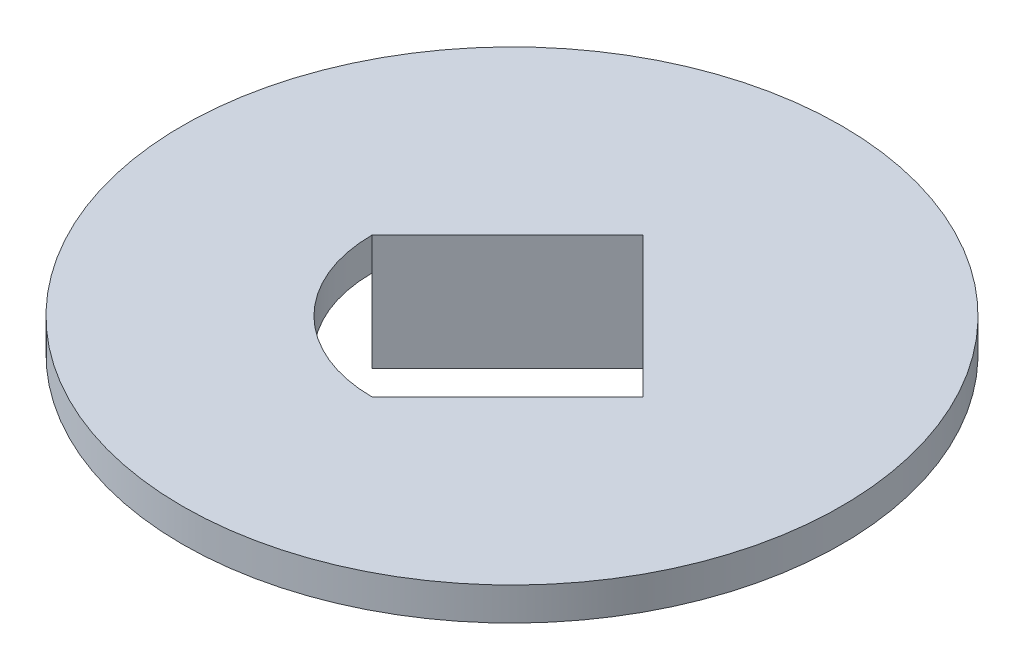
ISO-10303-21;
HEADER;
FILE_DESCRIPTION(('STEP AP214'),'2;1');
FILE_NAME('part.step','',(''),(''),'','','');
FILE_SCHEMA(('AUTOMOTIVE_DESIGN { 1 0 10303 214 1 1 1 1 }'));
ENDSEC;
DATA;
#1=APPLICATION_CONTEXT('core data for automotive mechanical design processes');
#2=APPLICATION_PROTOCOL_DEFINITION('international standard','automotive_design',2000,#1);
#3=PRODUCT_CONTEXT('',#1,'mechanical');
#4=PRODUCT('Part','Part','',(#3));
#5=PRODUCT_RELATED_PRODUCT_CATEGORY('part','',(#4));
#6=PRODUCT_DEFINITION_FORMATION('','',#4);
#7=PRODUCT_DEFINITION_CONTEXT('part definition',#1,'design');
#8=PRODUCT_DEFINITION('design','',#6,#7);
#9=PRODUCT_DEFINITION_SHAPE('','',#8);
#10=(LENGTH_UNIT() NAMED_UNIT(*) SI_UNIT(.MILLI.,.METRE.));
#11=(NAMED_UNIT(*) PLANE_ANGLE_UNIT() SI_UNIT($,.RADIAN.));
#12=(NAMED_UNIT(*) SI_UNIT($,.STERADIAN.) SOLID_ANGLE_UNIT());
#13=UNCERTAINTY_MEASURE_WITH_UNIT(LENGTH_MEASURE(1.E-05),#10,'distance_accuracy_value','');
#14=(GEOMETRIC_REPRESENTATION_CONTEXT(3) GLOBAL_UNCERTAINTY_ASSIGNED_CONTEXT((#13)) GLOBAL_UNIT_ASSIGNED_CONTEXT((#10,
#11,#12)) REPRESENTATION_CONTEXT('',''));
#15=CARTESIAN_POINT('',(0.,0.,0.));
#16=DIRECTION('',(0.,0.,1.));
#17=DIRECTION('',(1.,0.,0.));
#18=AXIS2_PLACEMENT_3D('',#15,#16,#17);
#19=CARTESIAN_POINT('',(0.,1.,0.));
#20=DIRECTION('',(0.,-1.,0.));
#21=DIRECTION('',(0.,0.,-1.));
#22=AXIS2_PLACEMENT_3D('',#19,#20,#21);
#23=CYLINDRICAL_SURFACE('',#22,10.);
#24=CARTESIAN_POINT('',(0.,1.,0.));
#25=DIRECTION('',(0.,1.,0.));
#26=DIRECTION('',(0.,0.,1.));
#27=AXIS2_PLACEMENT_3D('',#24,#25,#26);
#28=CIRCLE('',#27,10.);
#29=CARTESIAN_POINT('',(0.,1.,10.));
#30=VERTEX_POINT('',#29);
#31=EDGE_CURVE('E11',#30,#30,#28,.T.);
#32=ORIENTED_EDGE('',*,*,#31,.F.);
#33=EDGE_LOOP('',(#32));
#34=FACE_BOUND('',#33,.T.);
#35=CARTESIAN_POINT('',(0.,0.,0.));
#36=DIRECTION('',(0.,1.,0.));
#37=DIRECTION('',(0.,0.,1.));
#38=AXIS2_PLACEMENT_3D('',#35,#36,#37);
#39=CIRCLE('',#38,10.);
#40=CARTESIAN_POINT('',(0.,0.,10.));
#41=VERTEX_POINT('',#40);
#42=EDGE_CURVE('E40',#41,#41,#39,.T.);
#43=ORIENTED_EDGE('',*,*,#42,.T.);
#44=EDGE_LOOP('',(#43));
#45=FACE_BOUND('',#44,.T.);
#46=ADVANCED_FACE('F37',(#34,#45),#23,.T.);
#47=CARTESIAN_POINT('',(0.,1.,0.));
#48=DIRECTION('',(0.,1.,0.));
#49=DIRECTION('',(0.,0.,1.));
#50=AXIS2_PLACEMENT_3D('',#47,#48,#49);
#51=PLANE('',#50);
#52=DIRECTION('',(-0.707106781186559,0.,0.707106781186536));
#53=VECTOR('',#52,1.);
#54=CARTESIAN_POINT('',(-2.12499999999995,1.,-2.12500000000002));
#55=LINE('',#54,#53);
#56=CARTESIAN_POINT('',(-0.138270177077543,1.,-4.11172982292236));
#57=VERTEX_POINT('',#56);
#58=CARTESIAN_POINT('',(-4.25,1.,0.));
#59=VERTEX_POINT('',#58);
#60=EDGE_CURVE('E108',#57,#59,#55,.T.);
#61=ORIENTED_EDGE('',*,*,#60,.F.);
#62=DIRECTION('',(-0.707106781186547,0.,-0.707106781186548));
#63=VECTOR('',#62,1.);
#64=CARTESIAN_POINT('',(1.98672982292241,1.,-1.98672982292241));
#65=LINE('',#64,#63);
#66=CARTESIAN_POINT('',(4.11926668484489,1.,0.145807039000079));
#67=VERTEX_POINT('',#66);
#68=EDGE_CURVE('E131',#67,#57,#65,.T.);
#69=ORIENTED_EDGE('',*,*,#68,.F.);
#70=DIRECTION('',(0.708401728339931,0.,-0.705809458200298));
#71=VECTOR('',#70,1.);
#72=CARTESIAN_POINT('',(2.12498572028798,1.,2.13279028703875));
#73=LINE('',#72,#71);
#74=CARTESIAN_POINT('',(0.,1.,4.25));
#75=VERTEX_POINT('',#74);
#76=EDGE_CURVE('E129',#75,#67,#73,.T.);
#77=ORIENTED_EDGE('',*,*,#76,.F.);
#78=CARTESIAN_POINT('',(0.,1.,0.));
#79=DIRECTION('',(0.,1.,0.));
#80=DIRECTION('',(0.,0.,1.));
#81=AXIS2_PLACEMENT_3D('',#78,#79,#80);
#82=CIRCLE('',#81,4.25);
#83=EDGE_CURVE('E87',#59,#75,#82,.T.);
#84=ORIENTED_EDGE('',*,*,#83,.F.);
#85=EDGE_LOOP('',(#61,#69,#77,#84));
#86=FACE_BOUND('',#85,.T.);
#87=ORIENTED_EDGE('',*,*,#31,.T.);
#88=EDGE_LOOP('',(#87));
#89=FACE_BOUND('',#88,.T.);
#90=ADVANCED_FACE('F138',(#86,#89),#51,.T.);
#91=CARTESIAN_POINT('',(0.,0.,0.));
#92=DIRECTION('',(0.,1.,0.));
#93=DIRECTION('',(0.,0.,1.));
#94=AXIS2_PLACEMENT_3D('',#91,#92,#93);
#95=PLANE('',#94);
#96=CARTESIAN_POINT('',(0.,0.,0.));
#97=DIRECTION('',(0.,-1.,0.));
#98=DIRECTION('',(0.,0.,1.));
#99=AXIS2_PLACEMENT_3D('',#96,#97,#98);
#100=CIRCLE('',#99,4.25);
#101=CARTESIAN_POINT('',(-4.25,0.,0.));
#102=VERTEX_POINT('',#101);
#103=CARTESIAN_POINT('',(0.,0.,4.25));
#104=VERTEX_POINT('',#103);
#105=EDGE_CURVE('E98',#102,#104,#100,.T.);
#106=ORIENTED_EDGE('',*,*,#105,.F.);
#107=CARTESIAN_POINT('',(0.,0.,0.));
#108=DIRECTION('',(0.,-1.,0.));
#109=DIRECTION('',(0.,0.,1.));
#110=AXIS2_PLACEMENT_3D('',#107,#108,#109);
#111=CIRCLE('',#110,4.25);
#112=EDGE_CURVE('E59',#104,#102,#111,.T.);
#113=ORIENTED_EDGE('',*,*,#112,.F.);
#114=EDGE_LOOP('',(#106,#113));
#115=FACE_BOUND('',#114,.T.);
#116=ORIENTED_EDGE('',*,*,#42,.F.);
#117=EDGE_LOOP('',(#116));
#118=FACE_BOUND('',#117,.T.);
#119=ADVANCED_FACE('F96',(#115,#118),#95,.F.);
#120=CARTESIAN_POINT('',(4.11926668484489,-2.5,0.145807039000079));
#121=DIRECTION('',(0.7058094582003,0.,0.70840172833993));
#122=DIRECTION('',(0.70840172833993,0.,-0.7058094582003));
#123=AXIS2_PLACEMENT_3D('',#120,#121,#122);
#124=PLANE('',#123);
#125=DIRECTION('',(0.,1.,0.));
#126=VECTOR('',#125,1.);
#127=CARTESIAN_POINT('',(0.,-2.5,4.25));
#128=LINE('',#127,#126);
#129=CARTESIAN_POINT('',(0.,-2.5,4.25));
#130=VERTEX_POINT('',#129);
#131=EDGE_CURVE('E104',#130,#104,#128,.T.);
#132=ORIENTED_EDGE('',*,*,#131,.T.);
#133=DIRECTION('',(0.,-1.,0.));
#134=VECTOR('',#133,1.);
#135=CARTESIAN_POINT('',(0.,2.5,4.25));
#136=LINE('',#135,#134);
#137=EDGE_CURVE('E84',#75,#104,#136,.T.);
#138=ORIENTED_EDGE('',*,*,#137,.F.);
#139=ORIENTED_EDGE('',*,*,#76,.T.);
#140=DIRECTION('',(0.,1.,0.));
#141=VECTOR('',#140,1.);
#142=CARTESIAN_POINT('',(4.11926668484489,-2.5,0.145807039000079));
#143=LINE('',#142,#141);
#144=CARTESIAN_POINT('',(4.11926668484489,-2.5,0.145807039000079));
#145=VERTEX_POINT('',#144);
#146=EDGE_CURVE('E51',#145,#67,#143,.T.);
#147=ORIENTED_EDGE('',*,*,#146,.F.);
#148=DIRECTION('',(0.70840172833993,0.,-0.7058094582003));
#149=VECTOR('',#148,1.);
#150=CARTESIAN_POINT('',(4.11926668484489,-2.5,0.145807039000079));
#151=LINE('',#150,#149);
#152=EDGE_CURVE('E111',#130,#145,#151,.T.);
#153=ORIENTED_EDGE('',*,*,#152,.F.);
#154=EDGE_LOOP('',(#132,#138,#139,#147,#153));
#155=FACE_BOUND('',#154,.T.);
#156=ADVANCED_FACE('F110',(#155),#124,.F.);
#157=CARTESIAN_POINT('',(-0.138270177077543,-2.5,-4.11172982292236));
#158=DIRECTION('',(0.707106781186548,0.,-0.707106781186547));
#159=DIRECTION('',(-0.707106781186547,0.,-0.707106781186548));
#160=AXIS2_PLACEMENT_3D('',#157,#158,#159);
#161=PLANE('',#160);
#162=ORIENTED_EDGE('',*,*,#146,.T.);
#163=ORIENTED_EDGE('',*,*,#68,.T.);
#164=DIRECTION('',(0.,1.,0.));
#165=VECTOR('',#164,1.);
#166=CARTESIAN_POINT('',(-0.138270177077543,-2.5,-4.11172982292236));
#167=LINE('',#166,#165);
#168=CARTESIAN_POINT('',(-0.138270177077543,-2.5,-4.11172982292236));
#169=VERTEX_POINT('',#168);
#170=EDGE_CURVE('E115',#169,#57,#167,.T.);
#171=ORIENTED_EDGE('',*,*,#170,.F.);
#172=DIRECTION('',(-0.707106781186547,0.,-0.707106781186548));
#173=VECTOR('',#172,1.);
#174=CARTESIAN_POINT('',(-0.138270177077543,-2.5,-4.11172982292236));
#175=LINE('',#174,#173);
#176=EDGE_CURVE('E123',#145,#169,#175,.T.);
#177=ORIENTED_EDGE('',*,*,#176,.F.);
#178=EDGE_LOOP('',(#162,#163,#171,#177));
#179=FACE_BOUND('',#178,.T.);
#180=ADVANCED_FACE('F142',(#179),#161,.F.);
#181=CARTESIAN_POINT('',(-4.25,-2.5,0.));
#182=DIRECTION('',(-0.707106781186539,0.,-0.707106781186556));
#183=DIRECTION('',(-0.707106781186556,0.,0.707106781186539));
#184=AXIS2_PLACEMENT_3D('',#181,#182,#183);
#185=PLANE('',#184);
#186=ORIENTED_EDGE('',*,*,#170,.T.);
#187=ORIENTED_EDGE('',*,*,#60,.T.);
#188=DIRECTION('',(0.,-1.,0.));
#189=VECTOR('',#188,1.);
#190=CARTESIAN_POINT('',(-4.25,2.5,0.));
#191=LINE('',#190,#189);
#192=EDGE_CURVE('E91',#59,#102,#191,.T.);
#193=ORIENTED_EDGE('',*,*,#192,.T.);
#194=DIRECTION('',(0.,1.,0.));
#195=VECTOR('',#194,1.);
#196=CARTESIAN_POINT('',(-4.25,-2.5,0.));
#197=LINE('',#196,#195);
#198=CARTESIAN_POINT('',(-4.25,-2.5,0.));
#199=VERTEX_POINT('',#198);
#200=EDGE_CURVE('E106',#199,#102,#197,.T.);
#201=ORIENTED_EDGE('',*,*,#200,.F.);
#202=DIRECTION('',(-0.707106781186556,0.,0.707106781186539));
#203=VECTOR('',#202,1.);
#204=CARTESIAN_POINT('',(-4.25,-2.5,0.));
#205=LINE('',#204,#203);
#206=EDGE_CURVE('E119',#169,#199,#205,.T.);
#207=ORIENTED_EDGE('',*,*,#206,.F.);
#208=EDGE_LOOP('',(#186,#187,#193,#201,#207));
#209=FACE_BOUND('',#208,.T.);
#210=ADVANCED_FACE('F134',(#209),#185,.F.);
#211=CARTESIAN_POINT('',(0.,-2.5,0.));
#212=DIRECTION('',(0.,1.,0.));
#213=DIRECTION('',(0.,0.,1.));
#214=AXIS2_PLACEMENT_3D('',#211,#212,#213);
#215=CYLINDRICAL_SURFACE('',#214,4.25);
#216=ORIENTED_EDGE('',*,*,#105,.T.);
#217=ORIENTED_EDGE('',*,*,#131,.F.);
#218=CARTESIAN_POINT('',(0.,-2.5,0.));
#219=DIRECTION('',(0.,-1.,0.));
#220=DIRECTION('',(0.,0.,-1.));
#221=AXIS2_PLACEMENT_3D('',#218,#219,#220);
#222=CIRCLE('',#221,4.25);
#223=EDGE_CURVE('E107',#199,#130,#222,.T.);
#224=ORIENTED_EDGE('',*,*,#223,.F.);
#225=ORIENTED_EDGE('',*,*,#200,.T.);
#226=EDGE_LOOP('',(#216,#217,#224,#225));
#227=FACE_BOUND('',#226,.T.);
#228=ADVANCED_FACE('F103',(#227),#215,.T.);
#229=CARTESIAN_POINT('',(0.,-2.5,0.));
#230=DIRECTION('',(0.,-1.,0.));
#231=DIRECTION('',(0.,0.,-1.));
#232=AXIS2_PLACEMENT_3D('',#229,#230,#231);
#233=PLANE('',#232);
#234=ORIENTED_EDGE('',*,*,#223,.T.);
#235=ORIENTED_EDGE('',*,*,#152,.T.);
#236=ORIENTED_EDGE('',*,*,#176,.T.);
#237=ORIENTED_EDGE('',*,*,#206,.T.);
#238=EDGE_LOOP('',(#234,#235,#236,#237));
#239=FACE_BOUND('',#238,.T.);
#240=ADVANCED_FACE('F144',(#239),#233,.T.);
#241=CARTESIAN_POINT('',(0.,2.5,0.));
#242=DIRECTION('',(0.,-1.,0.));
#243=DIRECTION('',(0.,0.,-1.));
#244=AXIS2_PLACEMENT_3D('',#241,#242,#243);
#245=CYLINDRICAL_SURFACE('',#244,4.25);
#246=ORIENTED_EDGE('',*,*,#83,.T.);
#247=ORIENTED_EDGE('',*,*,#137,.T.);
#248=ORIENTED_EDGE('',*,*,#112,.T.);
#249=ORIENTED_EDGE('',*,*,#192,.F.);
#250=EDGE_LOOP('',(#246,#247,#248,#249));
#251=FACE_BOUND('',#250,.T.);
#252=ADVANCED_FACE('F85',(#251),#245,.F.);
#253=CLOSED_SHELL('',(#46,#90,#119,#156,#180,#210,#228,#240,#252));
#254=MANIFOLD_SOLID_BREP('B2',#253);
#255=ADVANCED_BREP_SHAPE_REPRESENTATION('',(#18,#254),#14);
#256=SHAPE_DEFINITION_REPRESENTATION(#9,#255);
ENDSEC;
END-ISO-10303-21;
